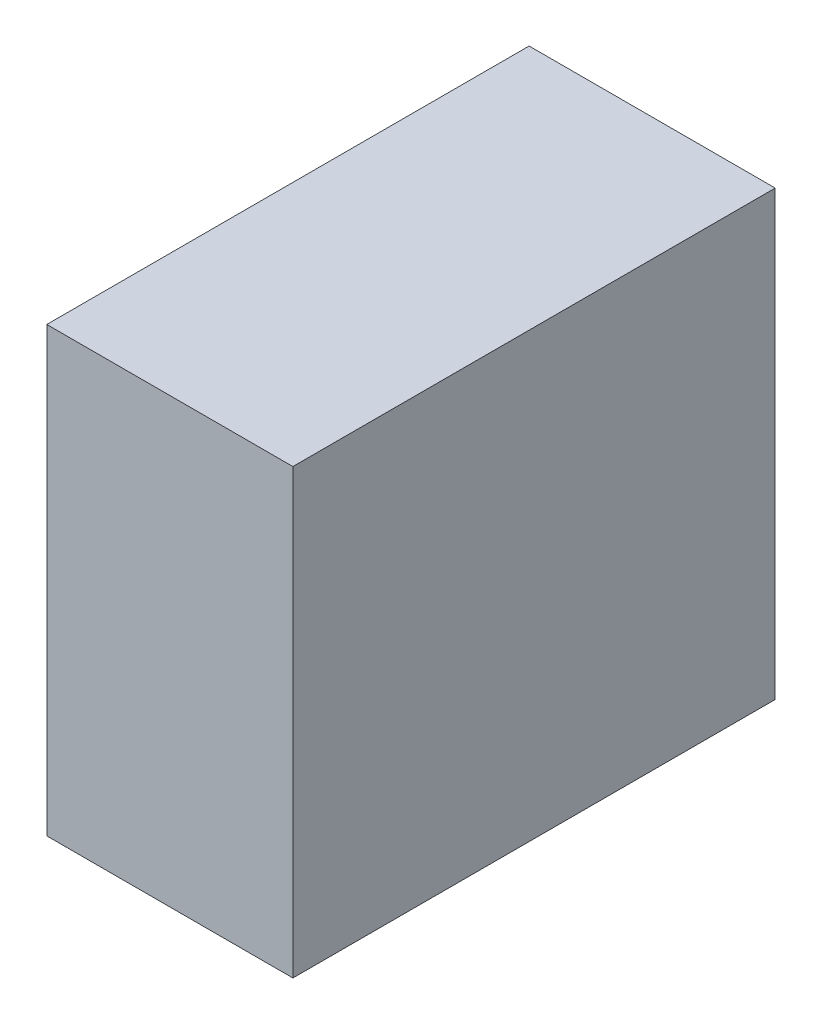
ISO-10303-21;
HEADER;
FILE_DESCRIPTION(('STEP AP214'),'2;1');
FILE_NAME('part.step','',(''),(''),'','','');
FILE_SCHEMA(('AUTOMOTIVE_DESIGN { 1 0 10303 214 1 1 1 1 }'));
ENDSEC;
DATA;
#1=APPLICATION_CONTEXT('core data for automotive mechanical design processes');
#2=APPLICATION_PROTOCOL_DEFINITION('international standard','automotive_design',2000,#1);
#3=PRODUCT_CONTEXT('',#1,'mechanical');
#4=PRODUCT('Part','Part','',(#3));
#5=PRODUCT_RELATED_PRODUCT_CATEGORY('part','',(#4));
#6=PRODUCT_DEFINITION_FORMATION('','',#4);
#7=PRODUCT_DEFINITION_CONTEXT('part definition',#1,'design');
#8=PRODUCT_DEFINITION('design','',#6,#7);
#9=PRODUCT_DEFINITION_SHAPE('','',#8);
#10=(LENGTH_UNIT() NAMED_UNIT(*) SI_UNIT(.MILLI.,.METRE.));
#11=(NAMED_UNIT(*) PLANE_ANGLE_UNIT() SI_UNIT($,.RADIAN.));
#12=(NAMED_UNIT(*) SI_UNIT($,.STERADIAN.) SOLID_ANGLE_UNIT());
#13=UNCERTAINTY_MEASURE_WITH_UNIT(LENGTH_MEASURE(1.E-05),#10,'distance_accuracy_value','');
#14=(GEOMETRIC_REPRESENTATION_CONTEXT(3) GLOBAL_UNCERTAINTY_ASSIGNED_CONTEXT((#13)) GLOBAL_UNIT_ASSIGNED_CONTEXT((#10,
#11,#12)) REPRESENTATION_CONTEXT('',''));
#15=CARTESIAN_POINT('',(0.,0.,0.));
#16=DIRECTION('',(0.,0.,1.));
#17=DIRECTION('',(1.,0.,0.));
#18=AXIS2_PLACEMENT_3D('',#15,#16,#17);
#19=CARTESIAN_POINT('',(0.,0.,98.));
#20=DIRECTION('',(1.,0.,0.));
#21=DIRECTION('',(0.,0.,-1.));
#22=AXIS2_PLACEMENT_3D('',#19,#20,#21);
#23=PLANE('',#22);
#24=DIRECTION('',(0.,-1.,0.));
#25=VECTOR('',#24,1.);
#26=CARTESIAN_POINT('',(0.,0.,0.));
#27=LINE('',#26,#25);
#28=CARTESIAN_POINT('',(0.,90.,0.));
#29=VERTEX_POINT('',#28);
#30=CARTESIAN_POINT('',(0.,0.,0.));
#31=VERTEX_POINT('',#30);
#32=EDGE_CURVE('E98',#29,#31,#27,.T.);
#33=ORIENTED_EDGE('',*,*,#32,.T.);
#34=DIRECTION('',(0.,0.,-1.));
#35=VECTOR('',#34,1.);
#36=CARTESIAN_POINT('',(0.,0.,98.));
#37=LINE('',#36,#35);
#38=CARTESIAN_POINT('',(0.,0.,98.));
#39=VERTEX_POINT('',#38);
#40=EDGE_CURVE('E11',#39,#31,#37,.T.);
#41=ORIENTED_EDGE('',*,*,#40,.F.);
#42=DIRECTION('',(0.,-1.,0.));
#43=VECTOR('',#42,1.);
#44=CARTESIAN_POINT('',(0.,0.,98.));
#45=LINE('',#44,#43);
#46=CARTESIAN_POINT('',(0.,90.,98.));
#47=VERTEX_POINT('',#46);
#48=EDGE_CURVE('E86',#47,#39,#45,.T.);
#49=ORIENTED_EDGE('',*,*,#48,.F.);
#50=DIRECTION('',(0.,0.,-1.));
#51=VECTOR('',#50,1.);
#52=CARTESIAN_POINT('',(0.,90.,98.));
#53=LINE('',#52,#51);
#54=EDGE_CURVE('E94',#47,#29,#53,.T.);
#55=ORIENTED_EDGE('',*,*,#54,.T.);
#56=EDGE_LOOP('',(#33,#41,#49,#55));
#57=FACE_BOUND('',#56,.T.);
#58=ADVANCED_FACE('F35',(#57),#23,.F.);
#59=CARTESIAN_POINT('',(0.,0.,98.));
#60=DIRECTION('',(0.,1.,0.));
#61=DIRECTION('',(0.,0.,1.));
#62=AXIS2_PLACEMENT_3D('',#59,#60,#61);
#63=PLANE('',#62);
#64=DIRECTION('',(1.,0.,0.));
#65=VECTOR('',#64,1.);
#66=CARTESIAN_POINT('',(0.,0.,0.));
#67=LINE('',#66,#65);
#68=CARTESIAN_POINT('',(50.,0.,0.));
#69=VERTEX_POINT('',#68);
#70=EDGE_CURVE('E90',#31,#69,#67,.T.);
#71=ORIENTED_EDGE('',*,*,#70,.T.);
#72=DIRECTION('',(0.,0.,-1.));
#73=VECTOR('',#72,1.);
#74=CARTESIAN_POINT('',(50.,0.,98.));
#75=LINE('',#74,#73);
#76=CARTESIAN_POINT('',(50.,0.,98.));
#77=VERTEX_POINT('',#76);
#78=EDGE_CURVE('E43',#77,#69,#75,.T.);
#79=ORIENTED_EDGE('',*,*,#78,.F.);
#80=DIRECTION('',(1.,0.,0.));
#81=VECTOR('',#80,1.);
#82=CARTESIAN_POINT('',(0.,0.,98.));
#83=LINE('',#82,#81);
#84=EDGE_CURVE('E81',#39,#77,#83,.T.);
#85=ORIENTED_EDGE('',*,*,#84,.F.);
#86=ORIENTED_EDGE('',*,*,#40,.T.);
#87=EDGE_LOOP('',(#71,#79,#85,#86));
#88=FACE_BOUND('',#87,.T.);
#89=ADVANCED_FACE('F89',(#88),#63,.F.);
#90=CARTESIAN_POINT('',(50.,0.,98.));
#91=DIRECTION('',(-1.,0.,0.));
#92=DIRECTION('',(0.,0.,1.));
#93=AXIS2_PLACEMENT_3D('',#90,#91,#92);
#94=PLANE('',#93);
#95=DIRECTION('',(0.,1.,0.));
#96=VECTOR('',#95,1.);
#97=CARTESIAN_POINT('',(50.,0.,0.));
#98=LINE('',#97,#96);
#99=CARTESIAN_POINT('',(50.,90.,0.));
#100=VERTEX_POINT('',#99);
#101=EDGE_CURVE('E68',#69,#100,#98,.T.);
#102=ORIENTED_EDGE('',*,*,#101,.T.);
#103=DIRECTION('',(0.,0.,-1.));
#104=VECTOR('',#103,1.);
#105=CARTESIAN_POINT('',(50.,90.,98.));
#106=LINE('',#105,#104);
#107=CARTESIAN_POINT('',(50.,90.,98.));
#108=VERTEX_POINT('',#107);
#109=EDGE_CURVE('E91',#108,#100,#106,.T.);
#110=ORIENTED_EDGE('',*,*,#109,.F.);
#111=DIRECTION('',(0.,1.,0.));
#112=VECTOR('',#111,1.);
#113=CARTESIAN_POINT('',(50.,0.,98.));
#114=LINE('',#113,#112);
#115=EDGE_CURVE('E84',#77,#108,#114,.T.);
#116=ORIENTED_EDGE('',*,*,#115,.F.);
#117=ORIENTED_EDGE('',*,*,#78,.T.);
#118=EDGE_LOOP('',(#102,#110,#116,#117));
#119=FACE_BOUND('',#118,.T.);
#120=ADVANCED_FACE('F92',(#119),#94,.F.);
#121=CARTESIAN_POINT('',(0.,90.,98.));
#122=DIRECTION('',(0.,-1.,0.));
#123=DIRECTION('',(0.,0.,-1.));
#124=AXIS2_PLACEMENT_3D('',#121,#122,#123);
#125=PLANE('',#124);
#126=DIRECTION('',(-1.,0.,0.));
#127=VECTOR('',#126,1.);
#128=CARTESIAN_POINT('',(0.,90.,0.));
#129=LINE('',#128,#127);
#130=EDGE_CURVE('E74',#100,#29,#129,.T.);
#131=ORIENTED_EDGE('',*,*,#130,.T.);
#132=ORIENTED_EDGE('',*,*,#54,.F.);
#133=DIRECTION('',(-1.,0.,0.));
#134=VECTOR('',#133,1.);
#135=CARTESIAN_POINT('',(0.,90.,98.));
#136=LINE('',#135,#134);
#137=EDGE_CURVE('E51',#108,#47,#136,.T.);
#138=ORIENTED_EDGE('',*,*,#137,.F.);
#139=ORIENTED_EDGE('',*,*,#109,.T.);
#140=EDGE_LOOP('',(#131,#132,#138,#139));
#141=FACE_BOUND('',#140,.T.);
#142=ADVANCED_FACE('F105',(#141),#125,.F.);
#143=CARTESIAN_POINT('',(0.,0.,98.));
#144=DIRECTION('',(0.,0.,-1.));
#145=DIRECTION('',(-1.,0.,0.));
#146=AXIS2_PLACEMENT_3D('',#143,#144,#145);
#147=PLANE('',#146);
#148=ORIENTED_EDGE('',*,*,#48,.T.);
#149=ORIENTED_EDGE('',*,*,#84,.T.);
#150=ORIENTED_EDGE('',*,*,#115,.T.);
#151=ORIENTED_EDGE('',*,*,#137,.T.);
#152=EDGE_LOOP('',(#148,#149,#150,#151));
#153=FACE_BOUND('',#152,.T.);
#154=ADVANCED_FACE('F82',(#153),#147,.F.);
#155=CARTESIAN_POINT('',(0.,0.,0.));
#156=DIRECTION('',(0.,0.,-1.));
#157=DIRECTION('',(-1.,0.,0.));
#158=AXIS2_PLACEMENT_3D('',#155,#156,#157);
#159=PLANE('',#158);
#160=ORIENTED_EDGE('',*,*,#32,.F.);
#161=ORIENTED_EDGE('',*,*,#130,.F.);
#162=ORIENTED_EDGE('',*,*,#101,.F.);
#163=ORIENTED_EDGE('',*,*,#70,.F.);
#164=EDGE_LOOP('',(#160,#161,#162,#163));
#165=FACE_BOUND('',#164,.T.);
#166=ADVANCED_FACE('F108',(#165),#159,.T.);
#167=CLOSED_SHELL('',(#58,#89,#120,#142,#154,#166));
#168=MANIFOLD_SOLID_BREP('B2',#167);
#169=ADVANCED_BREP_SHAPE_REPRESENTATION('',(#18,#168),#14);
#170=SHAPE_DEFINITION_REPRESENTATION(#9,#169);
ENDSEC;
END-ISO-10303-21;
